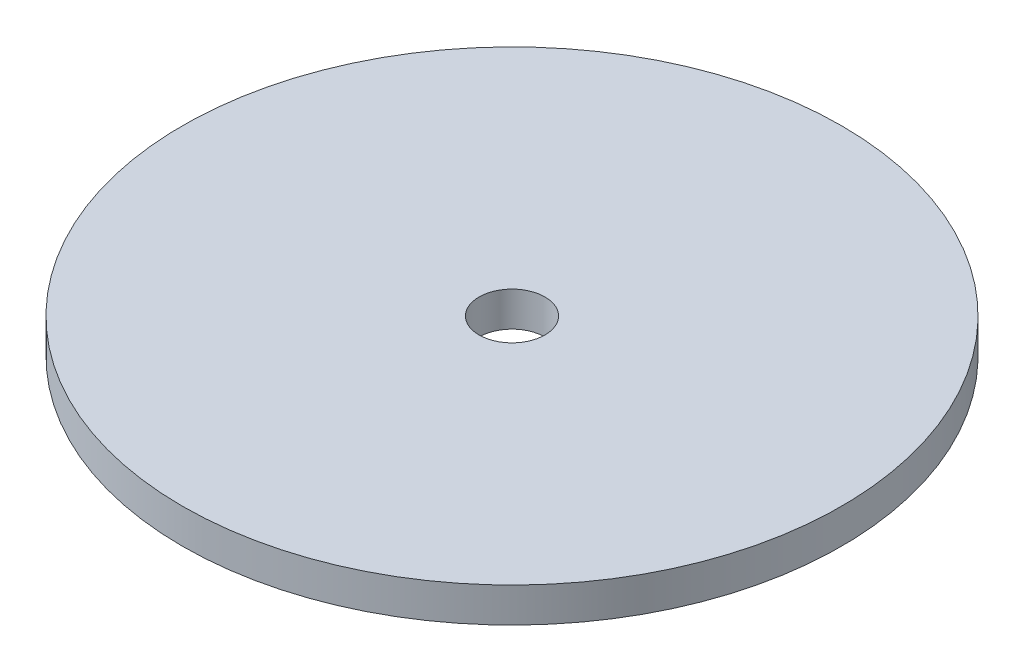
ISO-10303-21;
HEADER;
FILE_DESCRIPTION(('STEP AP214'),'2;1');
FILE_NAME('part.step','',(''),(''),'','','');
FILE_SCHEMA(('AUTOMOTIVE_DESIGN { 1 0 10303 214 1 1 1 1 }'));
ENDSEC;
DATA;
#1=APPLICATION_CONTEXT('core data for automotive mechanical design processes');
#2=APPLICATION_PROTOCOL_DEFINITION('international standard','automotive_design',2000,#1);
#3=PRODUCT_CONTEXT('',#1,'mechanical');
#4=PRODUCT('Part','Part','',(#3));
#5=PRODUCT_RELATED_PRODUCT_CATEGORY('part','',(#4));
#6=PRODUCT_DEFINITION_FORMATION('','',#4);
#7=PRODUCT_DEFINITION_CONTEXT('part definition',#1,'design');
#8=PRODUCT_DEFINITION('design','',#6,#7);
#9=PRODUCT_DEFINITION_SHAPE('','',#8);
#10=(LENGTH_UNIT() NAMED_UNIT(*) SI_UNIT(.MILLI.,.METRE.));
#11=(NAMED_UNIT(*) PLANE_ANGLE_UNIT() SI_UNIT($,.RADIAN.));
#12=(NAMED_UNIT(*) SI_UNIT($,.STERADIAN.) SOLID_ANGLE_UNIT());
#13=UNCERTAINTY_MEASURE_WITH_UNIT(LENGTH_MEASURE(1.E-05),#10,'distance_accuracy_value','');
#14=(GEOMETRIC_REPRESENTATION_CONTEXT(3) GLOBAL_UNCERTAINTY_ASSIGNED_CONTEXT((#13)) GLOBAL_UNIT_ASSIGNED_CONTEXT((#10,
#11,#12)) REPRESENTATION_CONTEXT('',''));
#15=CARTESIAN_POINT('',(0.,0.,0.));
#16=DIRECTION('',(0.,0.,1.));
#17=DIRECTION('',(1.,0.,0.));
#18=AXIS2_PLACEMENT_3D('',#15,#16,#17);
#19=CARTESIAN_POINT('',(0.,5.08,0.));
#20=DIRECTION('',(0.,1.,0.));
#21=DIRECTION('',(0.,0.,1.));
#22=AXIS2_PLACEMENT_3D('',#19,#20,#21);
#23=PLANE('',#22);
#24=CARTESIAN_POINT('',(0.,5.08,0.));
#25=DIRECTION('',(0.,1.,0.));
#26=DIRECTION('',(0.,0.,1.));
#27=AXIS2_PLACEMENT_3D('',#24,#25,#26);
#28=CIRCLE('',#27,48.26);
#29=CARTESIAN_POINT('',(0.,5.08,48.26));
#30=VERTEX_POINT('',#29);
#31=EDGE_CURVE('E10',#30,#30,#28,.T.);
#32=ORIENTED_EDGE('',*,*,#31,.T.);
#33=EDGE_LOOP('',(#32));
#34=FACE_BOUND('',#33,.T.);
#35=CARTESIAN_POINT('',(0.,5.08,0.));
#36=DIRECTION('',(0.,1.,0.));
#37=DIRECTION('',(0.,0.,1.));
#38=AXIS2_PLACEMENT_3D('',#35,#36,#37);
#39=CIRCLE('',#38,4.826);
#40=CARTESIAN_POINT('',(0.,5.08,4.826));
#41=VERTEX_POINT('',#40);
#42=EDGE_CURVE('E50',#41,#41,#39,.T.);
#43=ORIENTED_EDGE('',*,*,#42,.F.);
#44=EDGE_LOOP('',(#43));
#45=FACE_BOUND('',#44,.T.);
#46=ADVANCED_FACE('F37',(#34,#45),#23,.T.);
#47=CARTESIAN_POINT('',(0.,0.,0.));
#48=DIRECTION('',(0.,1.,0.));
#49=DIRECTION('',(0.,0.,1.));
#50=AXIS2_PLACEMENT_3D('',#47,#48,#49);
#51=PLANE('',#50);
#52=CARTESIAN_POINT('',(0.,0.,0.));
#53=DIRECTION('',(0.,1.,0.));
#54=DIRECTION('',(0.,0.,1.));
#55=AXIS2_PLACEMENT_3D('',#52,#53,#54);
#56=CIRCLE('',#55,48.26);
#57=CARTESIAN_POINT('',(0.,0.,48.26));
#58=VERTEX_POINT('',#57);
#59=EDGE_CURVE('E41',#58,#58,#56,.T.);
#60=ORIENTED_EDGE('',*,*,#59,.F.);
#61=EDGE_LOOP('',(#60));
#62=FACE_BOUND('',#61,.T.);
#63=CARTESIAN_POINT('',(0.,0.,0.));
#64=DIRECTION('',(0.,1.,0.));
#65=DIRECTION('',(0.,0.,1.));
#66=AXIS2_PLACEMENT_3D('',#63,#64,#65);
#67=CIRCLE('',#66,4.826);
#68=CARTESIAN_POINT('',(0.,0.,4.826));
#69=VERTEX_POINT('',#68);
#70=EDGE_CURVE('E52',#69,#69,#67,.T.);
#71=ORIENTED_EDGE('',*,*,#70,.T.);
#72=EDGE_LOOP('',(#71));
#73=FACE_BOUND('',#72,.T.);
#74=ADVANCED_FACE('F64',(#62,#73),#51,.F.);
#75=CARTESIAN_POINT('',(0.,5.08,0.));
#76=DIRECTION('',(0.,-1.,0.));
#77=DIRECTION('',(0.,0.,-1.));
#78=AXIS2_PLACEMENT_3D('',#75,#76,#77);
#79=CYLINDRICAL_SURFACE('',#78,48.26);
#80=ORIENTED_EDGE('',*,*,#31,.F.);
#81=EDGE_LOOP('',(#80));
#82=FACE_BOUND('',#81,.T.);
#83=ORIENTED_EDGE('',*,*,#59,.T.);
#84=EDGE_LOOP('',(#83));
#85=FACE_BOUND('',#84,.T.);
#86=ADVANCED_FACE('F39',(#82,#85),#79,.T.);
#87=CARTESIAN_POINT('',(0.,5.08,0.));
#88=DIRECTION('',(0.,-1.,0.));
#89=DIRECTION('',(0.,0.,-1.));
#90=AXIS2_PLACEMENT_3D('',#87,#88,#89);
#91=CYLINDRICAL_SURFACE('',#90,4.826);
#92=ORIENTED_EDGE('',*,*,#42,.T.);
#93=EDGE_LOOP('',(#92));
#94=FACE_BOUND('',#93,.T.);
#95=ORIENTED_EDGE('',*,*,#70,.F.);
#96=EDGE_LOOP('',(#95));
#97=FACE_BOUND('',#96,.T.);
#98=ADVANCED_FACE('F60',(#94,#97),#91,.F.);
#99=CLOSED_SHELL('',(#46,#74,#86,#98));
#100=MANIFOLD_SOLID_BREP('B2',#99);
#101=ADVANCED_BREP_SHAPE_REPRESENTATION('',(#18,#100),#14);
#102=SHAPE_DEFINITION_REPRESENTATION(#9,#101);
ENDSEC;
END-ISO-10303-21;
